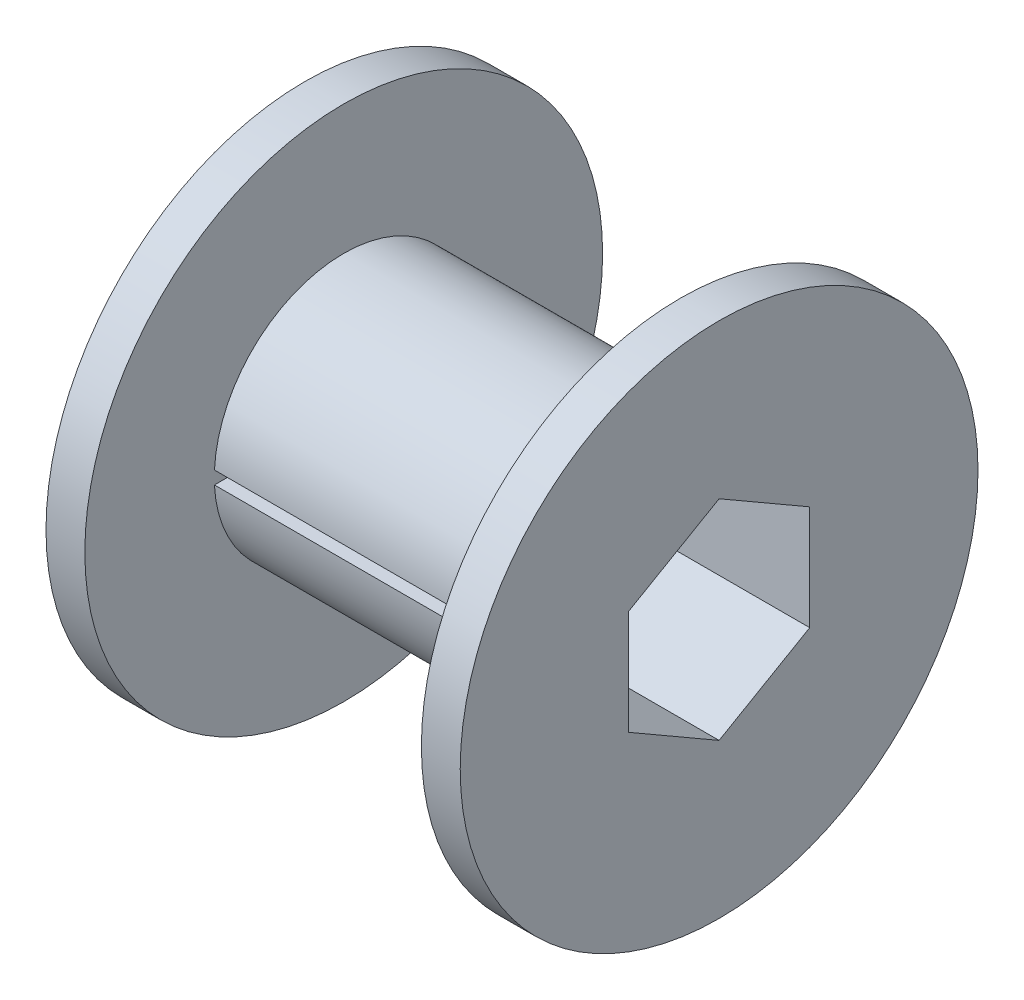
ISO-10303-21;
HEADER;
FILE_DESCRIPTION(('STEP AP214'),'2;1');
FILE_NAME('part.step','',(''),(''),'','','');
FILE_SCHEMA(('AUTOMOTIVE_DESIGN { 1 0 10303 214 1 1 1 1 }'));
ENDSEC;
DATA;
#1=APPLICATION_CONTEXT('core data for automotive mechanical design processes');
#2=APPLICATION_PROTOCOL_DEFINITION('international standard','automotive_design',2000,#1);
#3=PRODUCT_CONTEXT('',#1,'mechanical');
#4=PRODUCT('Part','Part','',(#3));
#5=PRODUCT_RELATED_PRODUCT_CATEGORY('part','',(#4));
#6=PRODUCT_DEFINITION_FORMATION('','',#4);
#7=PRODUCT_DEFINITION_CONTEXT('part definition',#1,'design');
#8=PRODUCT_DEFINITION('design','',#6,#7);
#9=PRODUCT_DEFINITION_SHAPE('','',#8);
#10=(LENGTH_UNIT() NAMED_UNIT(*) SI_UNIT(.MILLI.,.METRE.));
#11=(NAMED_UNIT(*) PLANE_ANGLE_UNIT() SI_UNIT($,.RADIAN.));
#12=(NAMED_UNIT(*) SI_UNIT($,.STERADIAN.) SOLID_ANGLE_UNIT());
#13=UNCERTAINTY_MEASURE_WITH_UNIT(LENGTH_MEASURE(1.E-05),#10,'distance_accuracy_value','');
#14=(GEOMETRIC_REPRESENTATION_CONTEXT(3) GLOBAL_UNCERTAINTY_ASSIGNED_CONTEXT((#13)) GLOBAL_UNIT_ASSIGNED_CONTEXT((#10,
#11,#12)) REPRESENTATION_CONTEXT('',''));
#15=CARTESIAN_POINT('',(0.,0.,0.));
#16=DIRECTION('',(0.,0.,1.));
#17=DIRECTION('',(1.,0.,0.));
#18=AXIS2_PLACEMENT_3D('',#15,#16,#17);
#19=CARTESIAN_POINT('',(4.,0.,0.));
#20=DIRECTION('',(-1.,0.,0.));
#21=DIRECTION('',(0.,0.,1.));
#22=AXIS2_PLACEMENT_3D('',#19,#20,#21);
#23=CYLINDRICAL_SURFACE('',#22,2.5);
#24=DIRECTION('',(-1.,0.,0.));
#25=VECTOR('',#24,1.);
#26=CARTESIAN_POINT('',(4.,-0.125,2.49687304442977));
#27=LINE('',#26,#25);
#28=CARTESIAN_POINT('',(-3.25,-0.125,2.49687304442977));
#29=VERTEX_POINT('',#28);
#30=CARTESIAN_POINT('',(3.25,-0.125,2.49687304442977));
#31=VERTEX_POINT('',#30);
#32=EDGE_CURVE('E109',#29,#31,#27,.F.);
#33=ORIENTED_EDGE('',*,*,#32,.F.);
#34=CARTESIAN_POINT('',(-3.25,0.,0.));
#35=DIRECTION('',(-1.,0.,0.));
#36=DIRECTION('',(0.,0.,1.));
#37=AXIS2_PLACEMENT_3D('',#34,#35,#36);
#38=CIRCLE('',#37,2.5);
#39=CARTESIAN_POINT('',(-3.25,0.125,2.49687304442977));
#40=VERTEX_POINT('',#39);
#41=EDGE_CURVE('E117',#40,#29,#38,.T.);
#42=ORIENTED_EDGE('',*,*,#41,.F.);
#43=DIRECTION('',(-1.,0.,0.));
#44=VECTOR('',#43,1.);
#45=CARTESIAN_POINT('',(4.,0.125,2.49687304442977));
#46=LINE('',#45,#44);
#47=CARTESIAN_POINT('',(3.25,0.125,2.49687304442977));
#48=VERTEX_POINT('',#47);
#49=EDGE_CURVE('E103',#48,#40,#46,.T.);
#50=ORIENTED_EDGE('',*,*,#49,.F.);
#51=CARTESIAN_POINT('',(3.25,0.,0.));
#52=DIRECTION('',(1.,0.,0.));
#53=DIRECTION('',(0.,0.,-1.));
#54=AXIS2_PLACEMENT_3D('',#51,#52,#53);
#55=CIRCLE('',#54,2.5);
#56=EDGE_CURVE('E123',#31,#48,#55,.T.);
#57=ORIENTED_EDGE('',*,*,#56,.F.);
#58=EDGE_LOOP('',(#33,#42,#50,#57));
#59=FACE_BOUND('',#58,.T.);
#60=ADVANCED_FACE('F32',(#59),#23,.T.);
#61=CARTESIAN_POINT('',(-4.,0.,1.75));
#62=DIRECTION('',(0.,0.,1.));
#63=DIRECTION('',(0.,-1.,0.));
#64=AXIS2_PLACEMENT_3D('',#61,#62,#63);
#65=PLANE('',#64);
#66=DIRECTION('',(1.,0.,0.));
#67=VECTOR('',#66,1.);
#68=CARTESIAN_POINT('',(-4.,-1.01036297108192,1.75));
#69=LINE('',#68,#67);
#70=CARTESIAN_POINT('',(-4.,-1.01036297108192,1.75));
#71=VERTEX_POINT('',#70);
#72=CARTESIAN_POINT('',(4.,-1.01036297108192,1.75));
#73=VERTEX_POINT('',#72);
#74=EDGE_CURVE('E189',#71,#73,#69,.T.);
#75=ORIENTED_EDGE('',*,*,#74,.F.);
#76=DIRECTION('',(0.,-1.,0.));
#77=VECTOR('',#76,1.);
#78=CARTESIAN_POINT('',(-4.,1.01036297108184,1.75));
#79=LINE('',#78,#77);
#80=CARTESIAN_POINT('',(-4.,1.01036297108184,1.75));
#81=VERTEX_POINT('',#80);
#82=EDGE_CURVE('E173',#81,#71,#79,.T.);
#83=ORIENTED_EDGE('',*,*,#82,.F.);
#84=DIRECTION('',(1.,0.,0.));
#85=VECTOR('',#84,1.);
#86=CARTESIAN_POINT('',(-4.,1.01036297108184,1.75));
#87=LINE('',#86,#85);
#88=CARTESIAN_POINT('',(4.,1.01036297108184,1.75));
#89=VERTEX_POINT('',#88);
#90=EDGE_CURVE('E191',#81,#89,#87,.T.);
#91=ORIENTED_EDGE('',*,*,#90,.T.);
#92=DIRECTION('',(0.,-1.,0.));
#93=VECTOR('',#92,1.);
#94=CARTESIAN_POINT('',(4.,1.01036297108184,1.75));
#95=LINE('',#94,#93);
#96=EDGE_CURVE('E156',#89,#73,#95,.T.);
#97=ORIENTED_EDGE('',*,*,#96,.T.);
#98=EDGE_LOOP('',(#75,#83,#91,#97));
#99=FACE_BOUND('',#98,.T.);
#100=DIRECTION('',(0.,1.,0.));
#101=VECTOR('',#100,1.);
#102=CARTESIAN_POINT('',(-3.25,0.,1.75));
#103=LINE('',#102,#101);
#104=CARTESIAN_POINT('',(-3.25,-0.125,1.75));
#105=VERTEX_POINT('',#104);
#106=CARTESIAN_POINT('',(-3.25,0.125,1.75));
#107=VERTEX_POINT('',#106);
#108=EDGE_CURVE('E11',#105,#107,#103,.T.);
#109=ORIENTED_EDGE('',*,*,#108,.F.);
#110=DIRECTION('',(-1.,0.,0.));
#111=VECTOR('',#110,1.);
#112=CARTESIAN_POINT('',(-4.,-0.125,1.75));
#113=LINE('',#112,#111);
#114=CARTESIAN_POINT('',(3.25,-0.125,1.75));
#115=VERTEX_POINT('',#114);
#116=EDGE_CURVE('E39',#115,#105,#113,.T.);
#117=ORIENTED_EDGE('',*,*,#116,.F.);
#118=DIRECTION('',(0.,-1.,0.));
#119=VECTOR('',#118,1.);
#120=CARTESIAN_POINT('',(3.25,0.,1.75));
#121=LINE('',#120,#119);
#122=CARTESIAN_POINT('',(3.25,0.125,1.75));
#123=VERTEX_POINT('',#122);
#124=EDGE_CURVE('E125',#123,#115,#121,.T.);
#125=ORIENTED_EDGE('',*,*,#124,.F.);
#126=DIRECTION('',(1.,0.,0.));
#127=VECTOR('',#126,1.);
#128=CARTESIAN_POINT('',(-4.,0.125,1.75));
#129=LINE('',#128,#127);
#130=EDGE_CURVE('E122',#107,#123,#129,.T.);
#131=ORIENTED_EDGE('',*,*,#130,.F.);
#132=EDGE_LOOP('',(#109,#117,#125,#131));
#133=FACE_BOUND('',#132,.T.);
#134=ADVANCED_FACE('F140',(#99,#133),#65,.F.);
#135=CARTESIAN_POINT('',(3.25,0.,0.));
#136=DIRECTION('',(1.,0.,0.));
#137=DIRECTION('',(0.,0.,-1.));
#138=AXIS2_PLACEMENT_3D('',#135,#136,#137);
#139=CYLINDRICAL_SURFACE('',#138,5.);
#140=CARTESIAN_POINT('',(3.25,0.,0.));
#141=DIRECTION('',(1.,0.,0.));
#142=DIRECTION('',(0.,0.,-1.));
#143=AXIS2_PLACEMENT_3D('',#140,#141,#142);
#144=CIRCLE('',#143,5.);
#145=CARTESIAN_POINT('',(3.25,0.,-5.));
#146=VERTEX_POINT('',#145);
#147=EDGE_CURVE('E127',#146,#146,#144,.T.);
#148=ORIENTED_EDGE('',*,*,#147,.T.);
#149=EDGE_LOOP('',(#148));
#150=FACE_BOUND('',#149,.T.);
#151=CARTESIAN_POINT('',(4.,0.,0.));
#152=DIRECTION('',(1.,0.,0.));
#153=DIRECTION('',(0.,0.,-1.));
#154=AXIS2_PLACEMENT_3D('',#151,#152,#153);
#155=CIRCLE('',#154,5.);
#156=CARTESIAN_POINT('',(4.,0.,-5.));
#157=VERTEX_POINT('',#156);
#158=EDGE_CURVE('E199',#157,#157,#155,.T.);
#159=ORIENTED_EDGE('',*,*,#158,.F.);
#160=EDGE_LOOP('',(#159));
#161=FACE_BOUND('',#160,.T.);
#162=ADVANCED_FACE('F208',(#150,#161),#139,.T.);
#163=CARTESIAN_POINT('',(3.25,0.,0.));
#164=DIRECTION('',(1.,0.,0.));
#165=DIRECTION('',(0.,0.,-1.));
#166=AXIS2_PLACEMENT_3D('',#163,#164,#165);
#167=PLANE('',#166);
#168=ORIENTED_EDGE('',*,*,#147,.F.);
#169=EDGE_LOOP('',(#168));
#170=FACE_BOUND('',#169,.T.);
#171=ORIENTED_EDGE('',*,*,#56,.T.);
#172=DIRECTION('',(0.,0.,-1.));
#173=VECTOR('',#172,1.);
#174=CARTESIAN_POINT('',(3.25,0.125,5.));
#175=LINE('',#174,#173);
#176=EDGE_CURVE('E46',#48,#123,#175,.T.);
#177=ORIENTED_EDGE('',*,*,#176,.T.);
#178=ORIENTED_EDGE('',*,*,#124,.T.);
#179=DIRECTION('',(0.,0.,-1.));
#180=VECTOR('',#179,1.);
#181=CARTESIAN_POINT('',(3.25,-0.125,5.));
#182=LINE('',#181,#180);
#183=EDGE_CURVE('E136',#31,#115,#182,.T.);
#184=ORIENTED_EDGE('',*,*,#183,.F.);
#185=EDGE_LOOP('',(#171,#177,#178,#184));
#186=FACE_BOUND('',#185,.T.);
#187=ADVANCED_FACE('F142',(#170,#186),#167,.F.);
#188=CARTESIAN_POINT('',(4.,0.,0.));
#189=DIRECTION('',(1.,0.,0.));
#190=DIRECTION('',(0.,0.,-1.));
#191=AXIS2_PLACEMENT_3D('',#188,#189,#190);
#192=PLANE('',#191);
#193=DIRECTION('',(0.,0.5,-0.866025403784438));
#194=VECTOR('',#193,1.);
#195=CARTESIAN_POINT('',(4.,-2.02072594216369,0.));
#196=LINE('',#195,#194);
#197=CARTESIAN_POINT('',(4.,-2.02072594216369,0.));
#198=VERTEX_POINT('',#197);
#199=CARTESIAN_POINT('',(4.,-1.01036297108185,-1.75));
#200=VERTEX_POINT('',#199);
#201=EDGE_CURVE('E162',#198,#200,#196,.T.);
#202=ORIENTED_EDGE('',*,*,#201,.F.);
#203=DIRECTION('',(0.,-0.499999999999944,-0.866025403784471));
#204=VECTOR('',#203,1.);
#205=CARTESIAN_POINT('',(4.,-1.01036297108192,1.75));
#206=LINE('',#205,#204);
#207=EDGE_CURVE('E159',#73,#198,#206,.T.);
#208=ORIENTED_EDGE('',*,*,#207,.F.);
#209=ORIENTED_EDGE('',*,*,#96,.F.);
#210=DIRECTION('',(0.,-0.5,0.866025403784439));
#211=VECTOR('',#210,1.);
#212=CARTESIAN_POINT('',(4.,2.02072594216369,0.));
#213=LINE('',#212,#211);
#214=CARTESIAN_POINT('',(4.,2.02072594216369,0.));
#215=VERTEX_POINT('',#214);
#216=EDGE_CURVE('E153',#215,#89,#213,.T.);
#217=ORIENTED_EDGE('',*,*,#216,.F.);
#218=DIRECTION('',(0.,0.5,0.866025403784439));
#219=VECTOR('',#218,1.);
#220=CARTESIAN_POINT('',(4.,1.01036297108184,-1.75));
#221=LINE('',#220,#219);
#222=CARTESIAN_POINT('',(4.,1.01036297108184,-1.75));
#223=VERTEX_POINT('',#222);
#224=EDGE_CURVE('E150',#223,#215,#221,.T.);
#225=ORIENTED_EDGE('',*,*,#224,.F.);
#226=DIRECTION('',(0.,1.,0.));
#227=VECTOR('',#226,1.);
#228=CARTESIAN_POINT('',(4.,-1.01036297108185,-1.75));
#229=LINE('',#228,#227);
#230=EDGE_CURVE('E147',#200,#223,#229,.T.);
#231=ORIENTED_EDGE('',*,*,#230,.F.);
#232=EDGE_LOOP('',(#202,#208,#209,#217,#225,#231));
#233=FACE_BOUND('',#232,.T.);
#234=ORIENTED_EDGE('',*,*,#158,.T.);
#235=EDGE_LOOP('',(#234));
#236=FACE_BOUND('',#235,.T.);
#237=ADVANCED_FACE('F206',(#233,#236),#192,.T.);
#238=CARTESIAN_POINT('',(-3.25,0.,0.));
#239=DIRECTION('',(-1.,0.,0.));
#240=DIRECTION('',(0.,0.,1.));
#241=AXIS2_PLACEMENT_3D('',#238,#239,#240);
#242=CYLINDRICAL_SURFACE('',#241,5.);
#243=CARTESIAN_POINT('',(-3.25,0.,0.));
#244=DIRECTION('',(1.,0.,0.));
#245=DIRECTION('',(0.,0.,-1.));
#246=AXIS2_PLACEMENT_3D('',#243,#244,#245);
#247=CIRCLE('',#246,5.);
#248=CARTESIAN_POINT('',(-3.25,0.,-5.));
#249=VERTEX_POINT('',#248);
#250=EDGE_CURVE('E196',#249,#249,#247,.T.);
#251=ORIENTED_EDGE('',*,*,#250,.F.);
#252=EDGE_LOOP('',(#251));
#253=FACE_BOUND('',#252,.T.);
#254=CARTESIAN_POINT('',(-4.,0.,0.));
#255=DIRECTION('',(1.,0.,0.));
#256=DIRECTION('',(0.,0.,-1.));
#257=AXIS2_PLACEMENT_3D('',#254,#255,#256);
#258=CIRCLE('',#257,5.);
#259=CARTESIAN_POINT('',(-4.,0.,-5.));
#260=VERTEX_POINT('',#259);
#261=EDGE_CURVE('E186',#260,#260,#258,.T.);
#262=ORIENTED_EDGE('',*,*,#261,.T.);
#263=EDGE_LOOP('',(#262));
#264=FACE_BOUND('',#263,.T.);
#265=ADVANCED_FACE('F249',(#253,#264),#242,.T.);
#266=CARTESIAN_POINT('',(-3.25,0.,0.));
#267=DIRECTION('',(-1.,0.,0.));
#268=DIRECTION('',(0.,0.,-1.));
#269=AXIS2_PLACEMENT_3D('',#266,#267,#268);
#270=PLANE('',#269);
#271=ORIENTED_EDGE('',*,*,#41,.T.);
#272=DIRECTION('',(0.,0.,-1.));
#273=VECTOR('',#272,1.);
#274=CARTESIAN_POINT('',(-3.25,-0.125,5.));
#275=LINE('',#274,#273);
#276=EDGE_CURVE('E110',#29,#105,#275,.T.);
#277=ORIENTED_EDGE('',*,*,#276,.T.);
#278=ORIENTED_EDGE('',*,*,#108,.T.);
#279=DIRECTION('',(0.,0.,-1.));
#280=VECTOR('',#279,1.);
#281=CARTESIAN_POINT('',(-3.25,0.125,5.));
#282=LINE('',#281,#280);
#283=EDGE_CURVE('E51',#40,#107,#282,.T.);
#284=ORIENTED_EDGE('',*,*,#283,.F.);
#285=EDGE_LOOP('',(#271,#277,#278,#284));
#286=FACE_BOUND('',#285,.T.);
#287=ORIENTED_EDGE('',*,*,#250,.T.);
#288=EDGE_LOOP('',(#287));
#289=FACE_BOUND('',#288,.T.);
#290=ADVANCED_FACE('F114',(#286,#289),#270,.F.);
#291=CARTESIAN_POINT('',(-4.,0.,0.));
#292=DIRECTION('',(1.,0.,0.));
#293=DIRECTION('',(0.,0.,-1.));
#294=AXIS2_PLACEMENT_3D('',#291,#292,#293);
#295=PLANE('',#294);
#296=DIRECTION('',(0.,-0.499999999999944,-0.866025403784471));
#297=VECTOR('',#296,1.);
#298=CARTESIAN_POINT('',(-4.,-1.01036297108192,1.75));
#299=LINE('',#298,#297);
#300=CARTESIAN_POINT('',(-4.,-2.02072594216369,0.));
#301=VERTEX_POINT('',#300);
#302=EDGE_CURVE('E176',#71,#301,#299,.T.);
#303=ORIENTED_EDGE('',*,*,#302,.T.);
#304=DIRECTION('',(0.,0.5,-0.866025403784438));
#305=VECTOR('',#304,1.);
#306=CARTESIAN_POINT('',(-4.,-2.02072594216369,0.));
#307=LINE('',#306,#305);
#308=CARTESIAN_POINT('',(-4.,-1.01036297108185,-1.75));
#309=VERTEX_POINT('',#308);
#310=EDGE_CURVE('E179',#301,#309,#307,.T.);
#311=ORIENTED_EDGE('',*,*,#310,.T.);
#312=DIRECTION('',(0.,1.,0.));
#313=VECTOR('',#312,1.);
#314=CARTESIAN_POINT('',(-4.,-1.01036297108185,-1.75));
#315=LINE('',#314,#313);
#316=CARTESIAN_POINT('',(-4.,1.01036297108184,-1.75));
#317=VERTEX_POINT('',#316);
#318=EDGE_CURVE('E164',#309,#317,#315,.T.);
#319=ORIENTED_EDGE('',*,*,#318,.T.);
#320=DIRECTION('',(0.,0.5,0.866025403784439));
#321=VECTOR('',#320,1.);
#322=CARTESIAN_POINT('',(-4.,1.01036297108184,-1.75));
#323=LINE('',#322,#321);
#324=CARTESIAN_POINT('',(-4.,2.02072594216369,0.));
#325=VERTEX_POINT('',#324);
#326=EDGE_CURVE('E167',#317,#325,#323,.T.);
#327=ORIENTED_EDGE('',*,*,#326,.T.);
#328=DIRECTION('',(0.,-0.5,0.866025403784439));
#329=VECTOR('',#328,1.);
#330=CARTESIAN_POINT('',(-4.,2.02072594216369,0.));
#331=LINE('',#330,#329);
#332=EDGE_CURVE('E170',#325,#81,#331,.T.);
#333=ORIENTED_EDGE('',*,*,#332,.T.);
#334=ORIENTED_EDGE('',*,*,#82,.T.);
#335=EDGE_LOOP('',(#303,#311,#319,#327,#333,#334));
#336=FACE_BOUND('',#335,.T.);
#337=ORIENTED_EDGE('',*,*,#261,.F.);
#338=EDGE_LOOP('',(#337));
#339=FACE_BOUND('',#338,.T.);
#340=ADVANCED_FACE('F264',(#336,#339),#295,.F.);
#341=CARTESIAN_POINT('',(-4.,-1.51554445662277,-0.875));
#342=DIRECTION('',(0.,-0.866025403784439,-0.5));
#343=DIRECTION('',(0.,0.5,-0.866025403784439));
#344=AXIS2_PLACEMENT_3D('',#341,#342,#343);
#345=PLANE('',#344);
#346=DIRECTION('',(1.,0.,0.));
#347=VECTOR('',#346,1.);
#348=CARTESIAN_POINT('',(-4.,-1.01036297108185,-1.75));
#349=LINE('',#348,#347);
#350=EDGE_CURVE('E183',#309,#200,#349,.T.);
#351=ORIENTED_EDGE('',*,*,#350,.F.);
#352=ORIENTED_EDGE('',*,*,#310,.F.);
#353=DIRECTION('',(1.,0.,0.));
#354=VECTOR('',#353,1.);
#355=CARTESIAN_POINT('',(-4.,-2.02072594216369,0.));
#356=LINE('',#355,#354);
#357=EDGE_CURVE('E187',#301,#198,#356,.T.);
#358=ORIENTED_EDGE('',*,*,#357,.T.);
#359=ORIENTED_EDGE('',*,*,#201,.T.);
#360=EDGE_LOOP('',(#351,#352,#358,#359));
#361=FACE_BOUND('',#360,.T.);
#362=ADVANCED_FACE('F288',(#361),#345,.F.);
#363=CARTESIAN_POINT('',(-4.,-1.51554445662277,0.874999999999992));
#364=DIRECTION('',(0.,-0.866025403784439,0.5));
#365=DIRECTION('',(0.,-0.5,-0.866025403784439));
#366=AXIS2_PLACEMENT_3D('',#363,#364,#365);
#367=PLANE('',#366);
#368=ORIENTED_EDGE('',*,*,#357,.F.);
#369=ORIENTED_EDGE('',*,*,#302,.F.);
#370=ORIENTED_EDGE('',*,*,#74,.T.);
#371=ORIENTED_EDGE('',*,*,#207,.T.);
#372=EDGE_LOOP('',(#368,#369,#370,#371));
#373=FACE_BOUND('',#372,.T.);
#374=ADVANCED_FACE('F291',(#373),#367,.F.);
#375=CARTESIAN_POINT('',(-4.,1.51554445662277,0.875));
#376=DIRECTION('',(0.,0.866025403784438,0.5));
#377=DIRECTION('',(0.,-0.5,0.866025403784438));
#378=AXIS2_PLACEMENT_3D('',#375,#376,#377);
#379=PLANE('',#378);
#380=ORIENTED_EDGE('',*,*,#90,.F.);
#381=ORIENTED_EDGE('',*,*,#332,.F.);
#382=DIRECTION('',(1.,0.,0.));
#383=VECTOR('',#382,1.);
#384=CARTESIAN_POINT('',(-4.,2.02072594216369,0.));
#385=LINE('',#384,#383);
#386=EDGE_CURVE('E193',#325,#215,#385,.T.);
#387=ORIENTED_EDGE('',*,*,#386,.T.);
#388=ORIENTED_EDGE('',*,*,#216,.T.);
#389=EDGE_LOOP('',(#380,#381,#387,#388));
#390=FACE_BOUND('',#389,.T.);
#391=ADVANCED_FACE('F294',(#390),#379,.F.);
#392=CARTESIAN_POINT('',(-4.,1.51554445662277,-0.875));
#393=DIRECTION('',(0.,0.866025403784438,-0.500000000000001));
#394=DIRECTION('',(0.,0.500000000000001,0.866025403784438));
#395=AXIS2_PLACEMENT_3D('',#392,#393,#394);
#396=PLANE('',#395);
#397=ORIENTED_EDGE('',*,*,#386,.F.);
#398=ORIENTED_EDGE('',*,*,#326,.F.);
#399=DIRECTION('',(1.,0.,0.));
#400=VECTOR('',#399,1.);
#401=CARTESIAN_POINT('',(-4.,1.01036297108184,-1.75));
#402=LINE('',#401,#400);
#403=EDGE_CURVE('E182',#317,#223,#402,.T.);
#404=ORIENTED_EDGE('',*,*,#403,.T.);
#405=ORIENTED_EDGE('',*,*,#224,.T.);
#406=EDGE_LOOP('',(#397,#398,#404,#405));
#407=FACE_BOUND('',#406,.T.);
#408=ADVANCED_FACE('F299',(#407),#396,.F.);
#409=CARTESIAN_POINT('',(-4.,0.,-1.75));
#410=DIRECTION('',(0.,0.,-1.));
#411=DIRECTION('',(-1.,0.,0.));
#412=AXIS2_PLACEMENT_3D('',#409,#410,#411);
#413=PLANE('',#412);
#414=ORIENTED_EDGE('',*,*,#403,.F.);
#415=ORIENTED_EDGE('',*,*,#318,.F.);
#416=ORIENTED_EDGE('',*,*,#350,.T.);
#417=ORIENTED_EDGE('',*,*,#230,.T.);
#418=EDGE_LOOP('',(#414,#415,#416,#417));
#419=FACE_BOUND('',#418,.T.);
#420=ADVANCED_FACE('F274',(#419),#413,.F.);
#421=CARTESIAN_POINT('',(3.25,-0.125,5.));
#422=DIRECTION('',(0.,1.,0.));
#423=DIRECTION('',(0.,0.,1.));
#424=AXIS2_PLACEMENT_3D('',#421,#422,#423);
#425=PLANE('',#424);
#426=ORIENTED_EDGE('',*,*,#32,.T.);
#427=ORIENTED_EDGE('',*,*,#183,.T.);
#428=ORIENTED_EDGE('',*,*,#116,.T.);
#429=ORIENTED_EDGE('',*,*,#276,.F.);
#430=EDGE_LOOP('',(#426,#427,#428,#429));
#431=FACE_BOUND('',#430,.T.);
#432=ADVANCED_FACE('F134',(#431),#425,.T.);
#433=CARTESIAN_POINT('',(3.25,0.125,5.));
#434=DIRECTION('',(0.,-1.,0.));
#435=DIRECTION('',(0.,0.,-1.));
#436=AXIS2_PLACEMENT_3D('',#433,#434,#435);
#437=PLANE('',#436);
#438=ORIENTED_EDGE('',*,*,#49,.T.);
#439=ORIENTED_EDGE('',*,*,#283,.T.);
#440=ORIENTED_EDGE('',*,*,#130,.T.);
#441=ORIENTED_EDGE('',*,*,#176,.F.);
#442=EDGE_LOOP('',(#438,#439,#440,#441));
#443=FACE_BOUND('',#442,.T.);
#444=ADVANCED_FACE('F104',(#443),#437,.T.);
#445=CLOSED_SHELL('',(#60,#134,#162,#187,#237,#265,#290,#340,#362,#374,#391,#408,#420,#432,#444));
#446=MANIFOLD_SOLID_BREP('B2',#445);
#447=ADVANCED_BREP_SHAPE_REPRESENTATION('',(#18,#446),#14);
#448=SHAPE_DEFINITION_REPRESENTATION(#9,#447);
ENDSEC;
END-ISO-10303-21;
